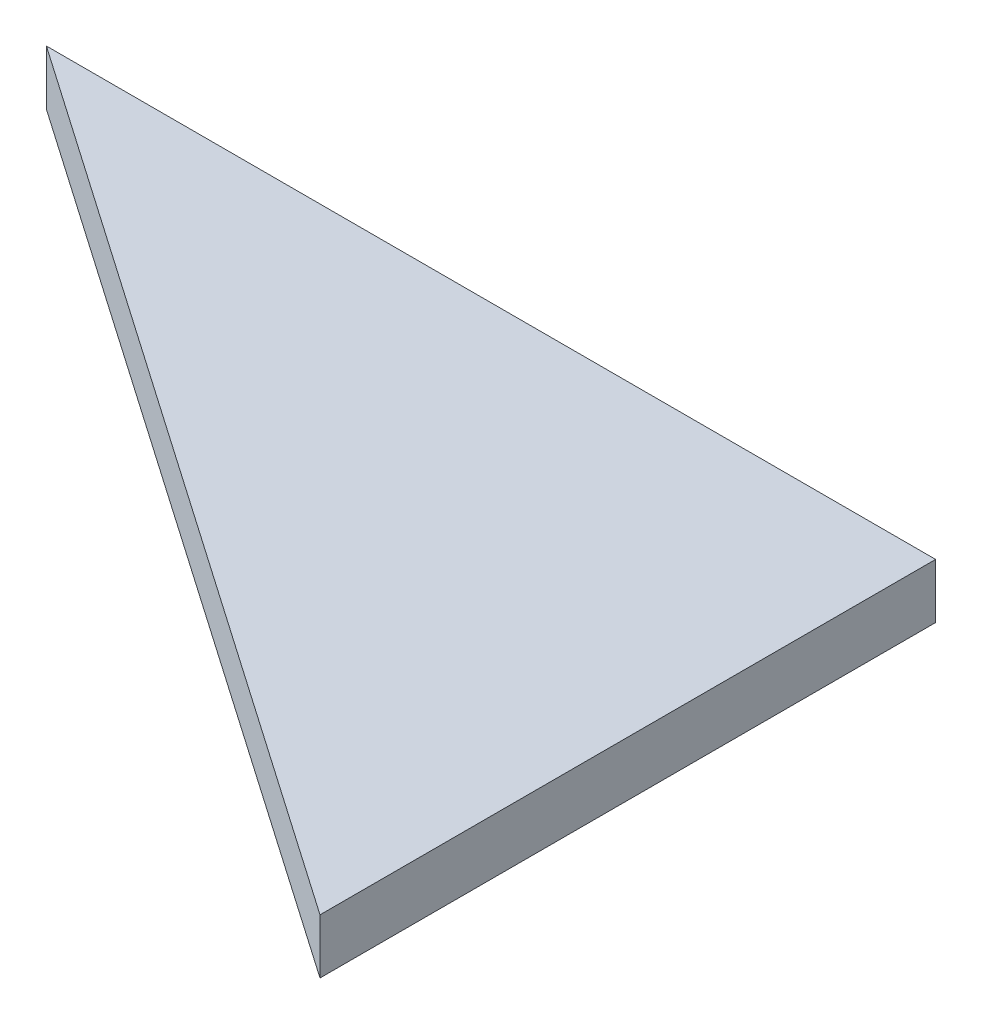
ISO-10303-21;
HEADER;
FILE_DESCRIPTION(('STEP AP214'),'2;1');
FILE_NAME('part.step','',(''),(''),'','','');
FILE_SCHEMA(('AUTOMOTIVE_DESIGN { 1 0 10303 214 1 1 1 1 }'));
ENDSEC;
DATA;
#1=APPLICATION_CONTEXT('core data for automotive mechanical design processes');
#2=APPLICATION_PROTOCOL_DEFINITION('international standard','automotive_design',2000,#1);
#3=PRODUCT_CONTEXT('',#1,'mechanical');
#4=PRODUCT('Part','Part','',(#3));
#5=PRODUCT_RELATED_PRODUCT_CATEGORY('part','',(#4));
#6=PRODUCT_DEFINITION_FORMATION('','',#4);
#7=PRODUCT_DEFINITION_CONTEXT('part definition',#1,'design');
#8=PRODUCT_DEFINITION('design','',#6,#7);
#9=PRODUCT_DEFINITION_SHAPE('','',#8);
#10=(LENGTH_UNIT() NAMED_UNIT(*) SI_UNIT(.MILLI.,.METRE.));
#11=(NAMED_UNIT(*) PLANE_ANGLE_UNIT() SI_UNIT($,.RADIAN.));
#12=(NAMED_UNIT(*) SI_UNIT($,.STERADIAN.) SOLID_ANGLE_UNIT());
#13=UNCERTAINTY_MEASURE_WITH_UNIT(LENGTH_MEASURE(1.E-05),#10,'distance_accuracy_value','');
#14=(GEOMETRIC_REPRESENTATION_CONTEXT(3) GLOBAL_UNCERTAINTY_ASSIGNED_CONTEXT((#13)) GLOBAL_UNIT_ASSIGNED_CONTEXT((#10,
#11,#12)) REPRESENTATION_CONTEXT('',''));
#15=CARTESIAN_POINT('',(0.,0.,0.));
#16=DIRECTION('',(0.,0.,1.));
#17=DIRECTION('',(1.,0.,0.));
#18=AXIS2_PLACEMENT_3D('',#15,#16,#17);
#19=CARTESIAN_POINT('',(-65.,4.,0.));
#20=DIRECTION('',(0.,0.,1.));
#21=DIRECTION('',(1.,0.,0.));
#22=AXIS2_PLACEMENT_3D('',#19,#20,#21);
#23=PLANE('',#22);
#24=DIRECTION('',(-1.,0.,0.));
#25=VECTOR('',#24,1.);
#26=CARTESIAN_POINT('',(-65.,0.,0.));
#27=LINE('',#26,#25);
#28=CARTESIAN_POINT('',(0.,0.,0.));
#29=VERTEX_POINT('',#28);
#30=CARTESIAN_POINT('',(-65.,0.,0.));
#31=VERTEX_POINT('',#30);
#32=EDGE_CURVE('E80',#29,#31,#27,.T.);
#33=ORIENTED_EDGE('',*,*,#32,.T.);
#34=DIRECTION('',(0.,-1.,0.));
#35=VECTOR('',#34,1.);
#36=CARTESIAN_POINT('',(-65.,4.,0.));
#37=LINE('',#36,#35);
#38=CARTESIAN_POINT('',(-65.,4.,0.));
#39=VERTEX_POINT('',#38);
#40=EDGE_CURVE('E11',#39,#31,#37,.T.);
#41=ORIENTED_EDGE('',*,*,#40,.F.);
#42=DIRECTION('',(-1.,0.,0.));
#43=VECTOR('',#42,1.);
#44=CARTESIAN_POINT('',(-65.,4.,0.));
#45=LINE('',#44,#43);
#46=CARTESIAN_POINT('',(0.,4.,0.));
#47=VERTEX_POINT('',#46);
#48=EDGE_CURVE('E73',#47,#39,#45,.T.);
#49=ORIENTED_EDGE('',*,*,#48,.F.);
#50=DIRECTION('',(0.,-1.,0.));
#51=VECTOR('',#50,1.);
#52=CARTESIAN_POINT('',(0.,4.,0.));
#53=LINE('',#52,#51);
#54=EDGE_CURVE('E81',#47,#29,#53,.T.);
#55=ORIENTED_EDGE('',*,*,#54,.T.);
#56=EDGE_LOOP('',(#33,#41,#49,#55));
#57=FACE_BOUND('',#56,.T.);
#58=ADVANCED_FACE('F33',(#57),#23,.F.);
#59=CARTESIAN_POINT('',(-1.57116660247941E-13,4.,45.));
#60=DIRECTION('',(0.569209978830309,0.,-0.822192191643778));
#61=DIRECTION('',(-0.822192191643778,0.,-0.569209978830309));
#62=AXIS2_PLACEMENT_3D('',#59,#60,#61);
#63=PLANE('',#62);
#64=DIRECTION('',(0.822192191643778,0.,0.569209978830309));
#65=VECTOR('',#64,1.);
#66=CARTESIAN_POINT('',(-1.57116660247941E-13,0.,45.));
#67=LINE('',#66,#65);
#68=CARTESIAN_POINT('',(-1.57116660247941E-13,0.,45.));
#69=VERTEX_POINT('',#68);
#70=EDGE_CURVE('E61',#31,#69,#67,.T.);
#71=ORIENTED_EDGE('',*,*,#70,.T.);
#72=DIRECTION('',(0.,-1.,0.));
#73=VECTOR('',#72,1.);
#74=CARTESIAN_POINT('',(-1.57116660247941E-13,4.,45.));
#75=LINE('',#74,#73);
#76=CARTESIAN_POINT('',(-1.57116660247941E-13,4.,45.));
#77=VERTEX_POINT('',#76);
#78=EDGE_CURVE('E41',#77,#69,#75,.T.);
#79=ORIENTED_EDGE('',*,*,#78,.F.);
#80=DIRECTION('',(0.822192191643778,0.,0.569209978830309));
#81=VECTOR('',#80,1.);
#82=CARTESIAN_POINT('',(-1.57116660247941E-13,4.,45.));
#83=LINE('',#82,#81);
#84=EDGE_CURVE('E69',#39,#77,#83,.T.);
#85=ORIENTED_EDGE('',*,*,#84,.F.);
#86=ORIENTED_EDGE('',*,*,#40,.T.);
#87=EDGE_LOOP('',(#71,#79,#85,#86));
#88=FACE_BOUND('',#87,.T.);
#89=ADVANCED_FACE('F70',(#88),#63,.F.);
#90=CARTESIAN_POINT('',(0.,4.,0.));
#91=DIRECTION('',(-1.,0.,0.));
#92=DIRECTION('',(0.,0.,1.));
#93=AXIS2_PLACEMENT_3D('',#90,#91,#92);
#94=PLANE('',#93);
#95=DIRECTION('',(0.,0.,-1.));
#96=VECTOR('',#95,1.);
#97=CARTESIAN_POINT('',(0.,0.,0.));
#98=LINE('',#97,#96);
#99=EDGE_CURVE('E66',#69,#29,#98,.T.);
#100=ORIENTED_EDGE('',*,*,#99,.T.);
#101=ORIENTED_EDGE('',*,*,#54,.F.);
#102=DIRECTION('',(0.,0.,-1.));
#103=VECTOR('',#102,1.);
#104=CARTESIAN_POINT('',(0.,4.,0.));
#105=LINE('',#104,#103);
#106=EDGE_CURVE('E49',#77,#47,#105,.T.);
#107=ORIENTED_EDGE('',*,*,#106,.F.);
#108=ORIENTED_EDGE('',*,*,#78,.T.);
#109=EDGE_LOOP('',(#100,#101,#107,#108));
#110=FACE_BOUND('',#109,.T.);
#111=ADVANCED_FACE('F88',(#110),#94,.F.);
#112=CARTESIAN_POINT('',(0.,4.,0.));
#113=DIRECTION('',(0.,-1.,0.));
#114=DIRECTION('',(0.,0.,-1.));
#115=AXIS2_PLACEMENT_3D('',#112,#113,#114);
#116=PLANE('',#115);
#117=ORIENTED_EDGE('',*,*,#48,.T.);
#118=ORIENTED_EDGE('',*,*,#84,.T.);
#119=ORIENTED_EDGE('',*,*,#106,.T.);
#120=EDGE_LOOP('',(#117,#118,#119));
#121=FACE_BOUND('',#120,.T.);
#122=ADVANCED_FACE('F76',(#121),#116,.F.);
#123=CARTESIAN_POINT('',(0.,0.,0.));
#124=DIRECTION('',(0.,-1.,0.));
#125=DIRECTION('',(0.,0.,-1.));
#126=AXIS2_PLACEMENT_3D('',#123,#124,#125);
#127=PLANE('',#126);
#128=ORIENTED_EDGE('',*,*,#32,.F.);
#129=ORIENTED_EDGE('',*,*,#99,.F.);
#130=ORIENTED_EDGE('',*,*,#70,.F.);
#131=EDGE_LOOP('',(#128,#129,#130));
#132=FACE_BOUND('',#131,.T.);
#133=ADVANCED_FACE('F89',(#132),#127,.T.);
#134=CLOSED_SHELL('',(#58,#89,#111,#122,#133));
#135=MANIFOLD_SOLID_BREP('B2',#134);
#136=ADVANCED_BREP_SHAPE_REPRESENTATION('',(#18,#135),#14);
#137=SHAPE_DEFINITION_REPRESENTATION(#9,#136);
ENDSEC;
END-ISO-10303-21;
